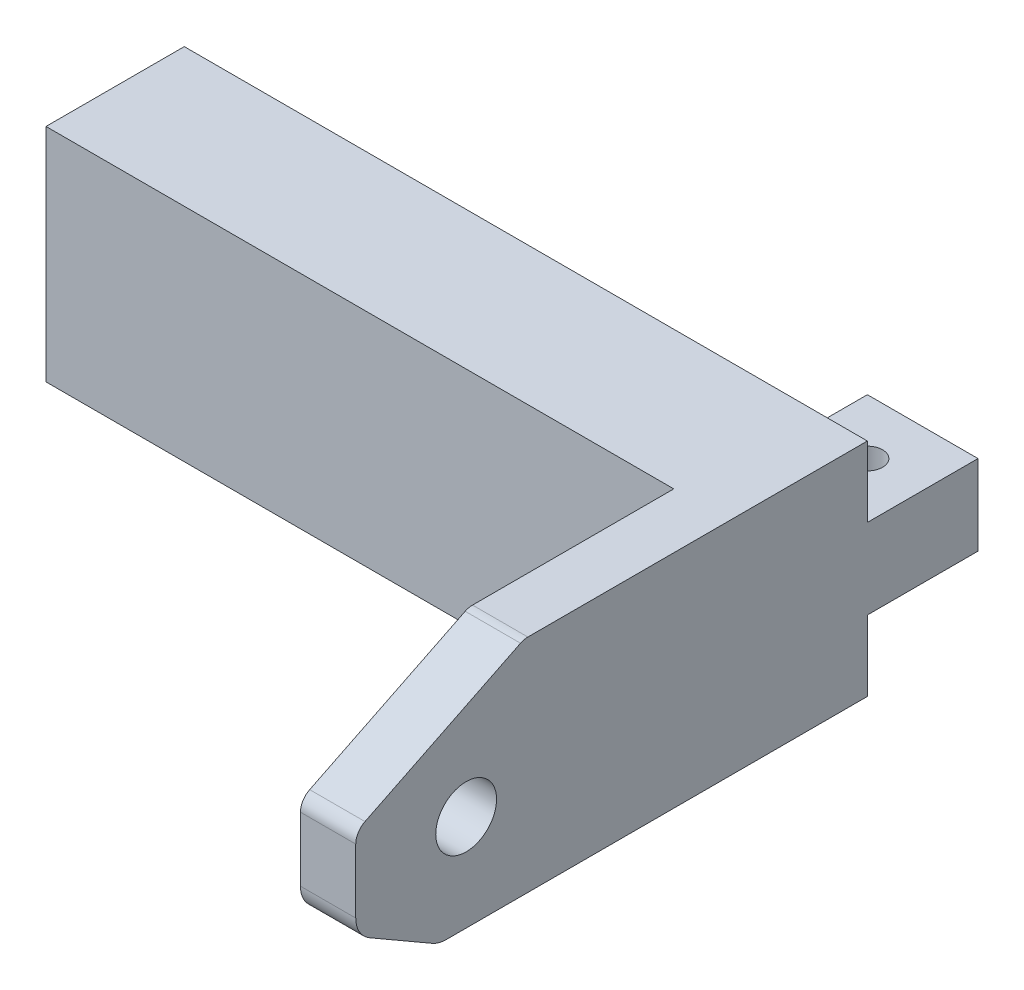
ISO-10303-21;
HEADER;
FILE_DESCRIPTION(('STEP AP214'),'2;1');
FILE_NAME('part.step','',(''),(''),'','','');
FILE_SCHEMA(('AUTOMOTIVE_DESIGN { 1 0 10303 214 1 1 1 1 }'));
ENDSEC;
DATA;
#1=APPLICATION_CONTEXT('core data for automotive mechanical design processes');
#2=APPLICATION_PROTOCOL_DEFINITION('international standard','automotive_design',2000,#1);
#3=PRODUCT_CONTEXT('',#1,'mechanical');
#4=PRODUCT('Part','Part','',(#3));
#5=PRODUCT_RELATED_PRODUCT_CATEGORY('part','',(#4));
#6=PRODUCT_DEFINITION_FORMATION('','',#4);
#7=PRODUCT_DEFINITION_CONTEXT('part definition',#1,'design');
#8=PRODUCT_DEFINITION('design','',#6,#7);
#9=PRODUCT_DEFINITION_SHAPE('','',#8);
#10=(LENGTH_UNIT() NAMED_UNIT(*) SI_UNIT(.MILLI.,.METRE.));
#11=(NAMED_UNIT(*) PLANE_ANGLE_UNIT() SI_UNIT($,.RADIAN.));
#12=(NAMED_UNIT(*) SI_UNIT($,.STERADIAN.) SOLID_ANGLE_UNIT());
#13=UNCERTAINTY_MEASURE_WITH_UNIT(LENGTH_MEASURE(1.E-05),#10,'distance_accuracy_value','');
#14=(GEOMETRIC_REPRESENTATION_CONTEXT(3) GLOBAL_UNCERTAINTY_ASSIGNED_CONTEXT((#13)) GLOBAL_UNIT_ASSIGNED_CONTEXT((#10,
#11,#12)) REPRESENTATION_CONTEXT('',''));
#15=CARTESIAN_POINT('',(0.,0.,0.));
#16=DIRECTION('',(0.,0.,1.));
#17=DIRECTION('',(1.,0.,0.));
#18=AXIS2_PLACEMENT_3D('',#15,#16,#17);
#19=CARTESIAN_POINT('',(10.,20.1295731707317,-35.9146341463414));
#20=DIRECTION('',(0.,0.,1.));
#21=DIRECTION('',(0.,1.,0.));
#22=AXIS2_PLACEMENT_3D('',#19,#20,#21);
#23=PLANE('',#22);
#24=DIRECTION('',(1.,0.,0.));
#25=VECTOR('',#24,1.);
#26=CARTESIAN_POINT('',(-10.,-7.12042682926831,-35.9146341463414));
#27=LINE('',#26,#25);
#28=CARTESIAN_POINT('',(-10.,-7.12042682926831,-35.9146341463414));
#29=VERTEX_POINT('',#28);
#30=CARTESIAN_POINT('',(10.,-7.12042682926831,-35.9146341463414));
#31=VERTEX_POINT('',#30);
#32=EDGE_CURVE('E218',#29,#31,#27,.T.);
#33=ORIENTED_EDGE('',*,*,#32,.T.);
#34=DIRECTION('',(0.,-1.,0.));
#35=VECTOR('',#34,1.);
#36=CARTESIAN_POINT('',(10.,20.1295731707317,-35.9146341463414));
#37=LINE('',#36,#35);
#38=CARTESIAN_POINT('',(10.,-19.8704268292683,-35.9146341463414));
#39=VERTEX_POINT('',#38);
#40=EDGE_CURVE('E285',#31,#39,#37,.T.);
#41=ORIENTED_EDGE('',*,*,#40,.T.);
#42=DIRECTION('',(-1.,0.,0.));
#43=VECTOR('',#42,1.);
#44=CARTESIAN_POINT('',(10.,-19.8704268292683,-35.9146341463414));
#45=LINE('',#44,#43);
#46=CARTESIAN_POINT('',(-113.5,-19.8704268292683,-35.9146341463414));
#47=VERTEX_POINT('',#46);
#48=EDGE_CURVE('E304',#39,#47,#45,.T.);
#49=ORIENTED_EDGE('',*,*,#48,.T.);
#50=DIRECTION('',(0.,1.,0.));
#51=VECTOR('',#50,1.);
#52=CARTESIAN_POINT('',(-113.5,20.1295731707317,-35.9146341463414));
#53=LINE('',#52,#51);
#54=CARTESIAN_POINT('',(-113.5,20.1295731707317,-35.9146341463414));
#55=VERTEX_POINT('',#54);
#56=EDGE_CURVE('E263',#47,#55,#53,.T.);
#57=ORIENTED_EDGE('',*,*,#56,.T.);
#58=DIRECTION('',(-1.,0.,0.));
#59=VECTOR('',#58,1.);
#60=CARTESIAN_POINT('',(10.,20.1295731707317,-35.9146341463414));
#61=LINE('',#60,#59);
#62=CARTESIAN_POINT('',(10.,20.1295731707317,-35.9146341463414));
#63=VERTEX_POINT('',#62);
#64=EDGE_CURVE('E293',#63,#55,#61,.T.);
#65=ORIENTED_EDGE('',*,*,#64,.F.);
#66=CARTESIAN_POINT('',(10.,7.37957317073169,-35.9146341463414));
#67=VERTEX_POINT('',#66);
#68=EDGE_CURVE('E282',#63,#67,#37,.T.);
#69=ORIENTED_EDGE('',*,*,#68,.T.);
#70=DIRECTION('',(-1.,0.,0.));
#71=VECTOR('',#70,1.);
#72=CARTESIAN_POINT('',(-10.,7.37957317073169,-35.9146341463414));
#73=LINE('',#72,#71);
#74=CARTESIAN_POINT('',(-10.,7.37957317073169,-35.9146341463414));
#75=VERTEX_POINT('',#74);
#76=EDGE_CURVE('E210',#67,#75,#73,.T.);
#77=ORIENTED_EDGE('',*,*,#76,.T.);
#78=DIRECTION('',(0.,-1.,0.));
#79=VECTOR('',#78,1.);
#80=CARTESIAN_POINT('',(-10.,7.37957317073169,-35.9146341463414));
#81=LINE('',#80,#79);
#82=EDGE_CURVE('E221',#75,#29,#81,.T.);
#83=ORIENTED_EDGE('',*,*,#82,.T.);
#84=EDGE_LOOP('',(#33,#41,#49,#57,#65,#69,#77,#83));
#85=FACE_BOUND('',#84,.T.);
#86=ADVANCED_FACE('F45',(#85),#23,.F.);
#87=CARTESIAN_POINT('',(0.,0.,0.));
#88=DIRECTION('',(1.,0.,0.));
#89=DIRECTION('',(0.,0.,1.));
#90=AXIS2_PLACEMENT_3D('',#87,#88,#89);
#91=PLANE('',#90);
#92=CARTESIAN_POINT('',(0.,-2.43042682926831,36.6253658536586));
#93=DIRECTION('',(1.,0.,0.));
#94=DIRECTION('',(0.,0.,-1.));
#95=AXIS2_PLACEMENT_3D('',#92,#93,#94);
#96=CIRCLE('',#95,5.5);
#97=CARTESIAN_POINT('',(0.,-2.43042682926831,31.1253658536586));
#98=VERTEX_POINT('',#97);
#99=EDGE_CURVE('E275',#98,#98,#96,.T.);
#100=ORIENTED_EDGE('',*,*,#99,.T.);
#101=EDGE_LOOP('',(#100));
#102=FACE_BOUND('',#101,.T.);
#103=DIRECTION('',(0.,0.499999999999998,0.86602540378444));
#104=VECTOR('',#103,1.);
#105=CARTESIAN_POINT('',(0.,-11.2101727914239,56.5853658536586));
#106=LINE('',#105,#104);
#107=CARTESIAN_POINT('',(0.,-12.653548464398,54.0853658536586));
#108=VERTEX_POINT('',#107);
#109=CARTESIAN_POINT('',(0.,-19.2005538481905,42.7456198915029));
#110=VERTEX_POINT('',#109);
#111=EDGE_CURVE('E363',#108,#110,#106,.F.);
#112=ORIENTED_EDGE('',*,*,#111,.F.);
#113=CARTESIAN_POINT('',(0.,-8.32342144547579,51.5853658536586));
#114=DIRECTION('',(-1.,0.,0.));
#115=DIRECTION('',(0.,0.,1.));
#116=AXIS2_PLACEMENT_3D('',#113,#114,#115);
#117=CIRCLE('',#116,5.);
#118=CARTESIAN_POINT('',(0.,-8.32342144547579,56.5853658536586));
#119=VERTEX_POINT('',#118);
#120=EDGE_CURVE('E381',#119,#108,#117,.F.);
#121=ORIENTED_EDGE('',*,*,#120,.F.);
#122=DIRECTION('',(0.,1.,0.));
#123=VECTOR('',#122,1.);
#124=CARTESIAN_POINT('',(0.,20.1295731707317,56.5853658536586));
#125=LINE('',#124,#123);
#126=CARTESIAN_POINT('',(0.,3.2640532905269,56.5853658536586));
#127=VERTEX_POINT('',#126);
#128=EDGE_CURVE('E296',#119,#127,#125,.T.);
#129=ORIENTED_EDGE('',*,*,#128,.T.);
#130=CARTESIAN_POINT('',(0.,3.2640532905269,53.5853658536586));
#131=DIRECTION('',(-1.,0.,0.));
#132=DIRECTION('',(0.,0.,1.));
#133=AXIS2_PLACEMENT_3D('',#130,#131,#132);
#134=CIRCLE('',#133,3.);
#135=CARTESIAN_POINT('',(0.,5.95467151512495,54.9122319243156));
#136=VERTEX_POINT('',#135);
#137=EDGE_CURVE('E345',#136,#127,#134,.F.);
#138=ORIENTED_EDGE('',*,*,#137,.F.);
#139=DIRECTION('',(0.,0.442288690219003,-0.896872741532688));
#140=VECTOR('',#139,1.);
#141=CARTESIAN_POINT('',(0.,20.1295731707317,26.1683748238203));
#142=LINE('',#141,#140);
#143=CARTESIAN_POINT('',(0.,19.8201913953298,26.7957390029667));
#144=VERTEX_POINT('',#143);
#145=EDGE_CURVE('E331',#144,#136,#142,.F.);
#146=ORIENTED_EDGE('',*,*,#145,.F.);
#147=CARTESIAN_POINT('',(0.,17.1295731707317,25.4688729323097));
#148=DIRECTION('',(-1.,0.,0.));
#149=DIRECTION('',(0.,0.,1.));
#150=AXIS2_PLACEMENT_3D('',#147,#148,#149);
#151=CIRCLE('',#150,3.);
#152=CARTESIAN_POINT('',(0.,20.1295731707317,25.4688729323097));
#153=VERTEX_POINT('',#152);
#154=EDGE_CURVE('E348',#153,#144,#151,.F.);
#155=ORIENTED_EDGE('',*,*,#154,.F.);
#156=DIRECTION('',(0.,0.,-1.));
#157=VECTOR('',#156,1.);
#158=CARTESIAN_POINT('',(0.,20.1295731707317,-35.9146341463414));
#159=LINE('',#158,#157);
#160=CARTESIAN_POINT('',(0.,20.1295731707317,-10.9146341463414));
#161=VERTEX_POINT('',#160);
#162=EDGE_CURVE('E299',#153,#161,#159,.T.);
#163=ORIENTED_EDGE('',*,*,#162,.T.);
#164=DIRECTION('',(0.,-1.,0.));
#165=VECTOR('',#164,1.);
#166=CARTESIAN_POINT('',(0.,20.1295731707317,-10.9146341463414));
#167=LINE('',#166,#165);
#168=CARTESIAN_POINT('',(0.,-19.8704268292683,-10.9146341463414));
#169=VERTEX_POINT('',#168);
#170=EDGE_CURVE('E258',#161,#169,#167,.T.);
#171=ORIENTED_EDGE('',*,*,#170,.T.);
#172=DIRECTION('',(0.,0.,1.));
#173=VECTOR('',#172,1.);
#174=CARTESIAN_POINT('',(0.,-19.8704268292683,-35.9146341463414));
#175=LINE('',#174,#173);
#176=CARTESIAN_POINT('',(0.,-19.8704268292683,40.2456198915029));
#177=VERTEX_POINT('',#176);
#178=EDGE_CURVE('E281',#169,#177,#175,.T.);
#179=ORIENTED_EDGE('',*,*,#178,.T.);
#180=CARTESIAN_POINT('',(0.,-14.8704268292683,40.2456198915029));
#181=DIRECTION('',(-1.,0.,0.));
#182=DIRECTION('',(0.,0.,1.));
#183=AXIS2_PLACEMENT_3D('',#180,#181,#182);
#184=CIRCLE('',#183,5.);
#185=EDGE_CURVE('E54',#110,#177,#184,.F.);
#186=ORIENTED_EDGE('',*,*,#185,.F.);
#187=EDGE_LOOP('',(#112,#121,#129,#138,#146,#155,#163,#171,#179,#186));
#188=FACE_BOUND('',#187,.T.);
#189=ADVANCED_FACE('F391',(#102,#188),#91,.F.);
#190=CARTESIAN_POINT('',(10.,-19.8704268292683,-35.9146341463414));
#191=DIRECTION('',(0.,1.,0.));
#192=DIRECTION('',(0.,0.,-1.));
#193=AXIS2_PLACEMENT_3D('',#190,#191,#192);
#194=PLANE('',#193);
#195=ORIENTED_EDGE('',*,*,#178,.F.);
#196=DIRECTION('',(1.,0.,0.));
#197=VECTOR('',#196,1.);
#198=CARTESIAN_POINT('',(-113.5,-19.8704268292683,-10.9146341463414));
#199=LINE('',#198,#197);
#200=CARTESIAN_POINT('',(-113.5,-19.8704268292683,-10.9146341463414));
#201=VERTEX_POINT('',#200);
#202=EDGE_CURVE('E273',#201,#169,#199,.T.);
#203=ORIENTED_EDGE('',*,*,#202,.F.);
#204=DIRECTION('',(0.,0.,-1.));
#205=VECTOR('',#204,1.);
#206=CARTESIAN_POINT('',(-113.5,-19.8704268292683,-10.9146341463414));
#207=LINE('',#206,#205);
#208=EDGE_CURVE('E261',#201,#47,#207,.T.);
#209=ORIENTED_EDGE('',*,*,#208,.T.);
#210=ORIENTED_EDGE('',*,*,#48,.F.);
#211=DIRECTION('',(0.,0.,1.));
#212=VECTOR('',#211,1.);
#213=CARTESIAN_POINT('',(10.,-19.8704268292683,-35.9146341463414));
#214=LINE('',#213,#212);
#215=CARTESIAN_POINT('',(10.,-19.8704268292683,40.2456198915029));
#216=VERTEX_POINT('',#215);
#217=EDGE_CURVE('E284',#39,#216,#214,.T.);
#218=ORIENTED_EDGE('',*,*,#217,.T.);
#219=DIRECTION('',(-1.,0.,0.));
#220=VECTOR('',#219,1.);
#221=CARTESIAN_POINT('',(10.,-19.8704268292683,40.2456198915029));
#222=LINE('',#221,#220);
#223=EDGE_CURVE('E369',#177,#216,#222,.F.);
#224=ORIENTED_EDGE('',*,*,#223,.F.);
#225=EDGE_LOOP('',(#195,#203,#209,#210,#218,#224));
#226=FACE_BOUND('',#225,.T.);
#227=ADVANCED_FACE('F395',(#226),#194,.F.);
#228=CARTESIAN_POINT('',(10.,20.1295731707317,56.5853658536586));
#229=DIRECTION('',(0.,0.,-1.));
#230=DIRECTION('',(1.,0.,0.));
#231=AXIS2_PLACEMENT_3D('',#228,#229,#230);
#232=PLANE('',#231);
#233=DIRECTION('',(0.,1.,0.));
#234=VECTOR('',#233,1.);
#235=CARTESIAN_POINT('',(10.,20.1295731707317,56.5853658536586));
#236=LINE('',#235,#234);
#237=CARTESIAN_POINT('',(10.,-8.32342144547579,56.5853658536586));
#238=VERTEX_POINT('',#237);
#239=CARTESIAN_POINT('',(10.,3.2640532905269,56.5853658536586));
#240=VERTEX_POINT('',#239);
#241=EDGE_CURVE('E288',#238,#240,#236,.T.);
#242=ORIENTED_EDGE('',*,*,#241,.T.);
#243=DIRECTION('',(-1.,0.,0.));
#244=VECTOR('',#243,1.);
#245=CARTESIAN_POINT('',(10.,3.2640532905269,56.5853658536586));
#246=LINE('',#245,#244);
#247=EDGE_CURVE('E360',#127,#240,#246,.F.);
#248=ORIENTED_EDGE('',*,*,#247,.F.);
#249=ORIENTED_EDGE('',*,*,#128,.F.);
#250=DIRECTION('',(1.,0.,0.));
#251=VECTOR('',#250,1.);
#252=CARTESIAN_POINT('',(0.,-8.32342144547579,56.5853658536586));
#253=LINE('',#252,#251);
#254=EDGE_CURVE('E11',#238,#119,#253,.F.);
#255=ORIENTED_EDGE('',*,*,#254,.F.);
#256=EDGE_LOOP('',(#242,#248,#249,#255));
#257=FACE_BOUND('',#256,.T.);
#258=ADVANCED_FACE('F409',(#257),#232,.F.);
#259=CARTESIAN_POINT('',(10.,20.1295731707317,-35.9146341463414));
#260=DIRECTION('',(0.,-1.,0.));
#261=DIRECTION('',(0.,0.,1.));
#262=AXIS2_PLACEMENT_3D('',#259,#260,#261);
#263=PLANE('',#262);
#264=DIRECTION('',(0.,0.,-1.));
#265=VECTOR('',#264,1.);
#266=CARTESIAN_POINT('',(10.,20.1295731707317,-35.9146341463414));
#267=LINE('',#266,#265);
#268=CARTESIAN_POINT('',(10.,20.1295731707317,25.4688729323097));
#269=VERTEX_POINT('',#268);
#270=EDGE_CURVE('E291',#269,#63,#267,.T.);
#271=ORIENTED_EDGE('',*,*,#270,.T.);
#272=ORIENTED_EDGE('',*,*,#64,.T.);
#273=DIRECTION('',(0.,0.,1.));
#274=VECTOR('',#273,1.);
#275=CARTESIAN_POINT('',(-113.5,20.1295731707317,-10.9146341463414));
#276=LINE('',#275,#274);
#277=CARTESIAN_POINT('',(-113.5,20.1295731707317,-10.9146341463414));
#278=VERTEX_POINT('',#277);
#279=EDGE_CURVE('E266',#55,#278,#276,.T.);
#280=ORIENTED_EDGE('',*,*,#279,.T.);
#281=DIRECTION('',(1.,0.,0.));
#282=VECTOR('',#281,1.);
#283=CARTESIAN_POINT('',(-113.5,20.1295731707317,-10.9146341463414));
#284=LINE('',#283,#282);
#285=EDGE_CURVE('E269',#278,#161,#284,.T.);
#286=ORIENTED_EDGE('',*,*,#285,.T.);
#287=ORIENTED_EDGE('',*,*,#162,.F.);
#288=DIRECTION('',(1.,0.,0.));
#289=VECTOR('',#288,1.);
#290=CARTESIAN_POINT('',(0.,20.1295731707317,25.4688729323097));
#291=LINE('',#290,#289);
#292=EDGE_CURVE('E343',#269,#153,#291,.F.);
#293=ORIENTED_EDGE('',*,*,#292,.F.);
#294=EDGE_LOOP('',(#271,#272,#280,#286,#287,#293));
#295=FACE_BOUND('',#294,.T.);
#296=ADVANCED_FACE('F424',(#295),#263,.F.);
#297=CARTESIAN_POINT('',(10.,0.,0.));
#298=DIRECTION('',(1.,0.,0.));
#299=DIRECTION('',(0.,0.,1.));
#300=AXIS2_PLACEMENT_3D('',#297,#298,#299);
#301=PLANE('',#300);
#302=CARTESIAN_POINT('',(10.,-2.43042682926831,36.6253658536586));
#303=DIRECTION('',(-1.,0.,0.));
#304=DIRECTION('',(0.,0.,1.));
#305=AXIS2_PLACEMENT_3D('',#302,#303,#304);
#306=CIRCLE('',#305,5.5);
#307=CARTESIAN_POINT('',(10.,-2.43042682926831,42.1253658536586));
#308=VERTEX_POINT('',#307);
#309=EDGE_CURVE('E278',#308,#308,#306,.T.);
#310=ORIENTED_EDGE('',*,*,#309,.T.);
#311=EDGE_LOOP('',(#310));
#312=FACE_BOUND('',#311,.T.);
#313=ORIENTED_EDGE('',*,*,#217,.F.);
#314=ORIENTED_EDGE('',*,*,#40,.F.);
#315=DIRECTION('',(0.,0.,1.));
#316=VECTOR('',#315,1.);
#317=CARTESIAN_POINT('',(10.,-7.12042682926831,-55.9146341463414));
#318=LINE('',#317,#316);
#319=CARTESIAN_POINT('',(10.,-7.12042682926831,-55.9146341463414));
#320=VERTEX_POINT('',#319);
#321=EDGE_CURVE('E69',#320,#31,#318,.T.);
#322=ORIENTED_EDGE('',*,*,#321,.F.);
#323=DIRECTION('',(0.,1.,0.));
#324=VECTOR('',#323,1.);
#325=CARTESIAN_POINT('',(10.,7.37957317073169,-55.9146341463414));
#326=LINE('',#325,#324);
#327=CARTESIAN_POINT('',(10.,7.37957317073169,-55.9146341463414));
#328=VERTEX_POINT('',#327);
#329=EDGE_CURVE('E201',#320,#328,#326,.T.);
#330=ORIENTED_EDGE('',*,*,#329,.T.);
#331=DIRECTION('',(0.,0.,1.));
#332=VECTOR('',#331,1.);
#333=CARTESIAN_POINT('',(10.,7.37957317073169,-55.9146341463414));
#334=LINE('',#333,#332);
#335=EDGE_CURVE('E207',#328,#67,#334,.T.);
#336=ORIENTED_EDGE('',*,*,#335,.T.);
#337=ORIENTED_EDGE('',*,*,#68,.F.);
#338=ORIENTED_EDGE('',*,*,#270,.F.);
#339=CARTESIAN_POINT('',(10.,17.1295731707317,25.4688729323097));
#340=DIRECTION('',(-1.,0.,0.));
#341=DIRECTION('',(0.,0.,1.));
#342=AXIS2_PLACEMENT_3D('',#339,#340,#341);
#343=CIRCLE('',#342,3.);
#344=CARTESIAN_POINT('',(10.,19.8201913953298,26.7957390029667));
#345=VERTEX_POINT('',#344);
#346=EDGE_CURVE('E358',#345,#269,#343,.T.);
#347=ORIENTED_EDGE('',*,*,#346,.F.);
#348=DIRECTION('',(0.,-0.442288690219003,0.896872741532688));
#349=VECTOR('',#348,1.);
#350=CARTESIAN_POINT('',(10.,26.5722242379764,13.1039708424363));
#351=LINE('',#350,#349);
#352=CARTESIAN_POINT('',(10.,5.95467151512495,54.9122319243156));
#353=VERTEX_POINT('',#352);
#354=EDGE_CURVE('E340',#353,#345,#351,.F.);
#355=ORIENTED_EDGE('',*,*,#354,.F.);
#356=CARTESIAN_POINT('',(10.,3.2640532905269,53.5853658536586));
#357=DIRECTION('',(-1.,0.,0.));
#358=DIRECTION('',(0.,0.,1.));
#359=AXIS2_PLACEMENT_3D('',#356,#357,#358);
#360=CIRCLE('',#359,3.);
#361=EDGE_CURVE('E355',#240,#353,#360,.T.);
#362=ORIENTED_EDGE('',*,*,#361,.F.);
#363=ORIENTED_EDGE('',*,*,#241,.F.);
#364=CARTESIAN_POINT('',(10.,-8.32342144547579,51.5853658536586));
#365=DIRECTION('',(-1.,0.,0.));
#366=DIRECTION('',(0.,0.,1.));
#367=AXIS2_PLACEMENT_3D('',#364,#365,#366);
#368=CIRCLE('',#367,5.);
#369=CARTESIAN_POINT('',(10.,-12.653548464398,54.0853658536586));
#370=VERTEX_POINT('',#369);
#371=EDGE_CURVE('E372',#370,#238,#368,.T.);
#372=ORIENTED_EDGE('',*,*,#371,.F.);
#373=DIRECTION('',(0.,-0.499999999999998,-0.86602540378444));
#374=VECTOR('',#373,1.);
#375=CARTESIAN_POINT('',(10.,-32.9098117494203,19.0004886725076));
#376=LINE('',#375,#374);
#377=CARTESIAN_POINT('',(10.,-19.2005538481905,42.7456198915029));
#378=VERTEX_POINT('',#377);
#379=EDGE_CURVE('E366',#378,#370,#376,.F.);
#380=ORIENTED_EDGE('',*,*,#379,.F.);
#381=CARTESIAN_POINT('',(10.,-14.8704268292683,40.2456198915029));
#382=DIRECTION('',(-1.,0.,0.));
#383=DIRECTION('',(0.,0.,1.));
#384=AXIS2_PLACEMENT_3D('',#381,#382,#383);
#385=CIRCLE('',#384,5.);
#386=EDGE_CURVE('E374',#216,#378,#385,.T.);
#387=ORIENTED_EDGE('',*,*,#386,.F.);
#388=EDGE_LOOP('',(#313,#314,#322,#330,#336,#337,#338,#347,#355,#362,#363,#372,#380,#387));
#389=FACE_BOUND('',#388,.T.);
#390=ADVANCED_FACE('F217',(#312,#389),#301,.T.);
#391=CARTESIAN_POINT('',(27.,-2.43042682926831,36.6253658536586));
#392=DIRECTION('',(-1.,0.,0.));
#393=DIRECTION('',(0.,0.,-1.));
#394=AXIS2_PLACEMENT_3D('',#391,#392,#393);
#395=CYLINDRICAL_SURFACE('',#394,5.5);
#396=ORIENTED_EDGE('',*,*,#309,.F.);
#397=EDGE_LOOP('',(#396));
#398=FACE_BOUND('',#397,.T.);
#399=ORIENTED_EDGE('',*,*,#99,.F.);
#400=EDGE_LOOP('',(#399));
#401=FACE_BOUND('',#400,.T.);
#402=ADVANCED_FACE('F535',(#398,#401),#395,.F.);
#403=CARTESIAN_POINT('',(-113.5,0.,0.));
#404=DIRECTION('',(-1.,0.,0.));
#405=DIRECTION('',(0.,0.,-1.));
#406=AXIS2_PLACEMENT_3D('',#403,#404,#405);
#407=PLANE('',#406);
#408=DIRECTION('',(0.,1.,0.));
#409=VECTOR('',#408,1.);
#410=CARTESIAN_POINT('',(-113.5,0.,-31.5396341463414));
#411=LINE('',#410,#409);
#412=CARTESIAN_POINT('',(-113.5,15.7545731707317,-31.5396341463414));
#413=VERTEX_POINT('',#412);
#414=CARTESIAN_POINT('',(-113.5,-15.4954268292683,-31.5396341463414));
#415=VERTEX_POINT('',#414);
#416=EDGE_CURVE('E316',#413,#415,#411,.F.);
#417=ORIENTED_EDGE('',*,*,#416,.F.);
#418=DIRECTION('',(0.,0.,1.));
#419=VECTOR('',#418,1.);
#420=CARTESIAN_POINT('',(-113.5,15.7545731707317,0.));
#421=LINE('',#420,#419);
#422=CARTESIAN_POINT('',(-113.5,15.7545731707317,-15.2896341463414));
#423=VERTEX_POINT('',#422);
#424=EDGE_CURVE('E313',#423,#413,#421,.F.);
#425=ORIENTED_EDGE('',*,*,#424,.F.);
#426=DIRECTION('',(0.,-1.,0.));
#427=VECTOR('',#426,1.);
#428=CARTESIAN_POINT('',(-113.5,0.,-15.2896341463414));
#429=LINE('',#428,#427);
#430=CARTESIAN_POINT('',(-113.5,-15.4954268292683,-15.2896341463414));
#431=VERTEX_POINT('',#430);
#432=EDGE_CURVE('E310',#431,#423,#429,.F.);
#433=ORIENTED_EDGE('',*,*,#432,.F.);
#434=DIRECTION('',(0.,0.,-1.));
#435=VECTOR('',#434,1.);
#436=CARTESIAN_POINT('',(-113.5,-15.4954268292683,0.));
#437=LINE('',#436,#435);
#438=EDGE_CURVE('E319',#415,#431,#437,.F.);
#439=ORIENTED_EDGE('',*,*,#438,.F.);
#440=EDGE_LOOP('',(#417,#425,#433,#439));
#441=FACE_BOUND('',#440,.T.);
#442=DIRECTION('',(0.,-1.,0.));
#443=VECTOR('',#442,1.);
#444=CARTESIAN_POINT('',(-113.5,20.1295731707317,-10.9146341463414));
#445=LINE('',#444,#443);
#446=EDGE_CURVE('E259',#278,#201,#445,.T.);
#447=ORIENTED_EDGE('',*,*,#446,.F.);
#448=ORIENTED_EDGE('',*,*,#279,.F.);
#449=ORIENTED_EDGE('',*,*,#56,.F.);
#450=ORIENTED_EDGE('',*,*,#208,.F.);
#451=EDGE_LOOP('',(#447,#448,#449,#450));
#452=FACE_BOUND('',#451,.T.);
#453=ADVANCED_FACE('F431',(#441,#452),#407,.T.);
#454=CARTESIAN_POINT('',(-113.5,20.1295731707317,-10.9146341463414));
#455=DIRECTION('',(0.,0.,-1.));
#456=DIRECTION('',(0.,-1.,0.));
#457=AXIS2_PLACEMENT_3D('',#454,#455,#456);
#458=PLANE('',#457);
#459=ORIENTED_EDGE('',*,*,#170,.F.);
#460=ORIENTED_EDGE('',*,*,#285,.F.);
#461=ORIENTED_EDGE('',*,*,#446,.T.);
#462=ORIENTED_EDGE('',*,*,#202,.T.);
#463=EDGE_LOOP('',(#459,#460,#461,#462));
#464=FACE_BOUND('',#463,.T.);
#465=ADVANCED_FACE('F427',(#464),#458,.F.);
#466=CARTESIAN_POINT('',(-113.5,12.7545731707317,-18.2896341463414));
#467=DIRECTION('',(0.,-1.,0.));
#468=DIRECTION('',(0.,0.,1.));
#469=AXIS2_PLACEMENT_3D('',#466,#467,#468);
#470=PLANE('',#469);
#471=DIRECTION('',(1.,0.,0.));
#472=VECTOR('',#471,1.);
#473=CARTESIAN_POINT('',(-113.5,12.7545731707317,-28.5396341463414));
#474=LINE('',#473,#472);
#475=CARTESIAN_POINT('',(-110.5,12.7545731707317,-28.5396341463414));
#476=VERTEX_POINT('',#475);
#477=CARTESIAN_POINT('',(0.,12.7545731707317,-28.5396341463414));
#478=VERTEX_POINT('',#477);
#479=EDGE_CURVE('E246',#476,#478,#474,.T.);
#480=ORIENTED_EDGE('',*,*,#479,.T.);
#481=DIRECTION('',(0.,0.,1.));
#482=VECTOR('',#481,1.);
#483=CARTESIAN_POINT('',(0.,12.7545731707317,-18.2896341463414));
#484=LINE('',#483,#482);
#485=CARTESIAN_POINT('',(0.,12.7545731707317,-18.2896341463414));
#486=VERTEX_POINT('',#485);
#487=EDGE_CURVE('E234',#478,#486,#484,.T.);
#488=ORIENTED_EDGE('',*,*,#487,.T.);
#489=DIRECTION('',(1.,0.,0.));
#490=VECTOR('',#489,1.);
#491=CARTESIAN_POINT('',(-113.5,12.7545731707317,-18.2896341463414));
#492=LINE('',#491,#490);
#493=CARTESIAN_POINT('',(-110.5,12.7545731707317,-18.2896341463414));
#494=VERTEX_POINT('',#493);
#495=EDGE_CURVE('E255',#494,#486,#492,.T.);
#496=ORIENTED_EDGE('',*,*,#495,.F.);
#497=DIRECTION('',(0.,0.,1.));
#498=VECTOR('',#497,1.);
#499=CARTESIAN_POINT('',(-110.5,12.7545731707317,-18.2896341463414));
#500=LINE('',#499,#498);
#501=EDGE_CURVE('E325',#476,#494,#500,.T.);
#502=ORIENTED_EDGE('',*,*,#501,.F.);
#503=EDGE_LOOP('',(#480,#488,#496,#502));
#504=FACE_BOUND('',#503,.T.);
#505=ADVANCED_FACE('F574',(#504),#470,.T.);
#506=CARTESIAN_POINT('',(-113.5,12.7545731707317,-18.2896341463414));
#507=DIRECTION('',(0.,0.,-1.));
#508=DIRECTION('',(0.,-1.,0.));
#509=AXIS2_PLACEMENT_3D('',#506,#507,#508);
#510=PLANE('',#509);
#511=ORIENTED_EDGE('',*,*,#495,.T.);
#512=DIRECTION('',(0.,-1.,0.));
#513=VECTOR('',#512,1.);
#514=CARTESIAN_POINT('',(0.,12.7545731707317,-18.2896341463414));
#515=LINE('',#514,#513);
#516=CARTESIAN_POINT('',(0.,-12.4954268292683,-18.2896341463414));
#517=VERTEX_POINT('',#516);
#518=EDGE_CURVE('E237',#486,#517,#515,.T.);
#519=ORIENTED_EDGE('',*,*,#518,.T.);
#520=DIRECTION('',(1.,0.,0.));
#521=VECTOR('',#520,1.);
#522=CARTESIAN_POINT('',(-113.5,-12.4954268292683,-18.2896341463414));
#523=LINE('',#522,#521);
#524=CARTESIAN_POINT('',(-110.5,-12.4954268292683,-18.2896341463414));
#525=VERTEX_POINT('',#524);
#526=EDGE_CURVE('E252',#525,#517,#523,.T.);
#527=ORIENTED_EDGE('',*,*,#526,.F.);
#528=DIRECTION('',(0.,-1.,0.));
#529=VECTOR('',#528,1.);
#530=CARTESIAN_POINT('',(-110.5,12.7545731707317,-18.2896341463414));
#531=LINE('',#530,#529);
#532=EDGE_CURVE('E328',#494,#525,#531,.T.);
#533=ORIENTED_EDGE('',*,*,#532,.F.);
#534=EDGE_LOOP('',(#511,#519,#527,#533));
#535=FACE_BOUND('',#534,.T.);
#536=ADVANCED_FACE('F582',(#535),#510,.T.);
#537=CARTESIAN_POINT('',(-113.5,-12.4954268292683,-18.2896341463414));
#538=DIRECTION('',(0.,1.,0.));
#539=DIRECTION('',(0.,0.,-1.));
#540=AXIS2_PLACEMENT_3D('',#537,#538,#539);
#541=PLANE('',#540);
#542=ORIENTED_EDGE('',*,*,#526,.T.);
#543=DIRECTION('',(0.,0.,-1.));
#544=VECTOR('',#543,1.);
#545=CARTESIAN_POINT('',(0.,-12.4954268292683,-18.2896341463414));
#546=LINE('',#545,#544);
#547=CARTESIAN_POINT('',(0.,-12.4954268292683,-28.5396341463414));
#548=VERTEX_POINT('',#547);
#549=EDGE_CURVE('E241',#517,#548,#546,.T.);
#550=ORIENTED_EDGE('',*,*,#549,.T.);
#551=DIRECTION('',(1.,0.,0.));
#552=VECTOR('',#551,1.);
#553=CARTESIAN_POINT('',(-113.5,-12.4954268292683,-28.5396341463414));
#554=LINE('',#553,#552);
#555=CARTESIAN_POINT('',(-110.5,-12.4954268292683,-28.5396341463414));
#556=VERTEX_POINT('',#555);
#557=EDGE_CURVE('E249',#556,#548,#554,.T.);
#558=ORIENTED_EDGE('',*,*,#557,.F.);
#559=DIRECTION('',(0.,0.,-1.));
#560=VECTOR('',#559,1.);
#561=CARTESIAN_POINT('',(-110.5,-12.4954268292683,-18.2896341463414));
#562=LINE('',#561,#560);
#563=EDGE_CURVE('E307',#525,#556,#562,.T.);
#564=ORIENTED_EDGE('',*,*,#563,.F.);
#565=EDGE_LOOP('',(#542,#550,#558,#564));
#566=FACE_BOUND('',#565,.T.);
#567=ADVANCED_FACE('F591',(#566),#541,.T.);
#568=CARTESIAN_POINT('',(-113.5,12.7545731707317,-28.5396341463414));
#569=DIRECTION('',(0.,0.,1.));
#570=DIRECTION('',(0.,1.,0.));
#571=AXIS2_PLACEMENT_3D('',#568,#569,#570);
#572=PLANE('',#571);
#573=ORIENTED_EDGE('',*,*,#557,.T.);
#574=DIRECTION('',(0.,1.,0.));
#575=VECTOR('',#574,1.);
#576=CARTESIAN_POINT('',(0.,12.7545731707317,-28.5396341463414));
#577=LINE('',#576,#575);
#578=EDGE_CURVE('E244',#548,#478,#577,.T.);
#579=ORIENTED_EDGE('',*,*,#578,.T.);
#580=ORIENTED_EDGE('',*,*,#479,.F.);
#581=DIRECTION('',(0.,1.,0.));
#582=VECTOR('',#581,1.);
#583=CARTESIAN_POINT('',(-110.5,12.7545731707317,-28.5396341463414));
#584=LINE('',#583,#582);
#585=EDGE_CURVE('E322',#556,#476,#584,.T.);
#586=ORIENTED_EDGE('',*,*,#585,.F.);
#587=EDGE_LOOP('',(#573,#579,#580,#586));
#588=FACE_BOUND('',#587,.T.);
#589=ADVANCED_FACE('F529',(#588),#572,.T.);
#590=ORIENTED_EDGE('',*,*,#578,.F.);
#591=ORIENTED_EDGE('',*,*,#549,.F.);
#592=ORIENTED_EDGE('',*,*,#518,.F.);
#593=ORIENTED_EDGE('',*,*,#487,.F.);
#594=EDGE_LOOP('',(#590,#591,#592,#593));
#595=FACE_BOUND('',#594,.T.);
#596=ADVANCED_FACE('F453',(#595),#91,.F.);
#597=CARTESIAN_POINT('',(-110.5,15.7545731707317,-18.2896341463414));
#598=DIRECTION('',(0.,0.,1.));
#599=DIRECTION('',(-1.,0.,0.));
#600=AXIS2_PLACEMENT_3D('',#597,#598,#599);
#601=CYLINDRICAL_SURFACE('',#600,3.);
#602=CARTESIAN_POINT('',(-110.5,15.7545731707317,-31.5396341463414));
#603=DIRECTION('',(0.,-0.707106781186547,-0.707106781186548));
#604=DIRECTION('',(0.,0.707106781186548,-0.707106781186547));
#605=AXIS2_PLACEMENT_3D('',#602,#603,#604);
#606=ELLIPSE('',#605,4.24264068711928,3.);
#607=EDGE_CURVE('E335',#413,#476,#606,.F.);
#608=ORIENTED_EDGE('',*,*,#607,.T.);
#609=ORIENTED_EDGE('',*,*,#501,.T.);
#610=CARTESIAN_POINT('',(-110.5,15.7545731707317,-15.2896341463414));
#611=DIRECTION('',(0.,0.707106781186548,-0.707106781186547));
#612=DIRECTION('',(0.,0.707106781186547,0.707106781186548));
#613=AXIS2_PLACEMENT_3D('',#610,#611,#612);
#614=ELLIPSE('',#613,4.24264068711929,3.);
#615=EDGE_CURVE('E238',#494,#423,#614,.T.);
#616=ORIENTED_EDGE('',*,*,#615,.T.);
#617=ORIENTED_EDGE('',*,*,#424,.T.);
#618=EDGE_LOOP('',(#608,#609,#616,#617));
#619=FACE_BOUND('',#618,.T.);
#620=ADVANCED_FACE('F468',(#619),#601,.T.);
#621=CARTESIAN_POINT('',(-110.5,12.7545731707317,-15.2896341463414));
#622=DIRECTION('',(0.,-1.,0.));
#623=DIRECTION('',(0.,0.,1.));
#624=AXIS2_PLACEMENT_3D('',#621,#622,#623);
#625=CYLINDRICAL_SURFACE('',#624,3.);
#626=ORIENTED_EDGE('',*,*,#615,.F.);
#627=ORIENTED_EDGE('',*,*,#532,.T.);
#628=CARTESIAN_POINT('',(-110.5,-15.4954268292683,-15.2896341463414));
#629=DIRECTION('',(0.,0.707106781186547,0.707106781186548));
#630=DIRECTION('',(0.,0.707106781186548,-0.707106781186547));
#631=AXIS2_PLACEMENT_3D('',#628,#629,#630);
#632=ELLIPSE('',#631,4.24264068711928,3.);
#633=EDGE_CURVE('E333',#525,#431,#632,.T.);
#634=ORIENTED_EDGE('',*,*,#633,.T.);
#635=ORIENTED_EDGE('',*,*,#432,.T.);
#636=EDGE_LOOP('',(#626,#627,#634,#635));
#637=FACE_BOUND('',#636,.T.);
#638=ADVANCED_FACE('F464',(#637),#625,.T.);
#639=CARTESIAN_POINT('',(-110.5,12.7545731707317,-31.5396341463414));
#640=DIRECTION('',(0.,1.,0.));
#641=DIRECTION('',(0.,0.,-1.));
#642=AXIS2_PLACEMENT_3D('',#639,#640,#641);
#643=CYLINDRICAL_SURFACE('',#642,3.);
#644=ORIENTED_EDGE('',*,*,#607,.F.);
#645=ORIENTED_EDGE('',*,*,#416,.T.);
#646=CARTESIAN_POINT('',(-110.5,-15.4954268292683,-31.5396341463414));
#647=DIRECTION('',(0.,-0.707106781186548,0.707106781186547));
#648=DIRECTION('',(0.,-0.707106781186547,-0.707106781186548));
#649=AXIS2_PLACEMENT_3D('',#646,#647,#648);
#650=ELLIPSE('',#649,4.24264068711929,3.);
#651=EDGE_CURVE('E214',#415,#556,#650,.F.);
#652=ORIENTED_EDGE('',*,*,#651,.T.);
#653=ORIENTED_EDGE('',*,*,#585,.T.);
#654=EDGE_LOOP('',(#644,#645,#652,#653));
#655=FACE_BOUND('',#654,.T.);
#656=ADVANCED_FACE('F460',(#655),#643,.T.);
#657=CARTESIAN_POINT('',(-110.5,-15.4954268292683,-18.2896341463414));
#658=DIRECTION('',(0.,0.,-1.));
#659=DIRECTION('',(1.,0.,0.));
#660=AXIS2_PLACEMENT_3D('',#657,#658,#659);
#661=CYLINDRICAL_SURFACE('',#660,3.);
#662=ORIENTED_EDGE('',*,*,#633,.F.);
#663=ORIENTED_EDGE('',*,*,#563,.T.);
#664=ORIENTED_EDGE('',*,*,#651,.F.);
#665=ORIENTED_EDGE('',*,*,#438,.T.);
#666=EDGE_LOOP('',(#662,#663,#664,#665));
#667=FACE_BOUND('',#666,.T.);
#668=ADVANCED_FACE('F457',(#667),#661,.T.);
#669=CARTESIAN_POINT('',(10.,20.1295731707317,26.1683748238203));
#670=DIRECTION('',(0.,-0.896872741532688,-0.442288690219002));
#671=DIRECTION('',(-1.,0.,0.));
#672=AXIS2_PLACEMENT_3D('',#669,#670,#671);
#673=PLANE('',#672);
#674=ORIENTED_EDGE('',*,*,#145,.T.);
#675=DIRECTION('',(1.,0.,0.));
#676=VECTOR('',#675,1.);
#677=CARTESIAN_POINT('',(0.,5.95467151512496,54.9122319243156));
#678=LINE('',#677,#676);
#679=EDGE_CURVE('E351',#353,#136,#678,.F.);
#680=ORIENTED_EDGE('',*,*,#679,.F.);
#681=ORIENTED_EDGE('',*,*,#354,.T.);
#682=DIRECTION('',(-1.,0.,0.));
#683=VECTOR('',#682,1.);
#684=CARTESIAN_POINT('',(10.,19.8201913953298,26.7957390029667));
#685=LINE('',#684,#683);
#686=EDGE_CURVE('E353',#144,#345,#685,.F.);
#687=ORIENTED_EDGE('',*,*,#686,.F.);
#688=EDGE_LOOP('',(#674,#680,#681,#687));
#689=FACE_BOUND('',#688,.T.);
#690=ADVANCED_FACE('F415',(#689),#673,.F.);
#691=CARTESIAN_POINT('',(10.,17.1295731707317,25.4688729323097));
#692=DIRECTION('',(-1.,0.,0.));
#693=DIRECTION('',(0.,0.,-1.));
#694=AXIS2_PLACEMENT_3D('',#691,#692,#693);
#695=CYLINDRICAL_SURFACE('',#694,3.);
#696=ORIENTED_EDGE('',*,*,#346,.T.);
#697=ORIENTED_EDGE('',*,*,#292,.T.);
#698=ORIENTED_EDGE('',*,*,#154,.T.);
#699=ORIENTED_EDGE('',*,*,#686,.T.);
#700=EDGE_LOOP('',(#696,#697,#698,#699));
#701=FACE_BOUND('',#700,.T.);
#702=ADVANCED_FACE('F419',(#701),#695,.T.);
#703=CARTESIAN_POINT('',(10.,3.2640532905269,53.5853658536586));
#704=DIRECTION('',(1.,0.,0.));
#705=DIRECTION('',(0.,0.,1.));
#706=AXIS2_PLACEMENT_3D('',#703,#704,#705);
#707=CYLINDRICAL_SURFACE('',#706,3.);
#708=ORIENTED_EDGE('',*,*,#137,.T.);
#709=ORIENTED_EDGE('',*,*,#247,.T.);
#710=ORIENTED_EDGE('',*,*,#361,.T.);
#711=ORIENTED_EDGE('',*,*,#679,.T.);
#712=EDGE_LOOP('',(#708,#709,#710,#711));
#713=FACE_BOUND('',#712,.T.);
#714=ADVANCED_FACE('F411',(#713),#707,.T.);
#715=CARTESIAN_POINT('',(10.,-11.2101727914239,56.5853658536586));
#716=DIRECTION('',(0.,0.86602540378444,-0.499999999999998));
#717=DIRECTION('',(-1.,0.,0.));
#718=AXIS2_PLACEMENT_3D('',#715,#716,#717);
#719=PLANE('',#718);
#720=ORIENTED_EDGE('',*,*,#379,.T.);
#721=DIRECTION('',(-1.,0.,0.));
#722=VECTOR('',#721,1.);
#723=CARTESIAN_POINT('',(10.,-12.653548464398,54.0853658536586));
#724=LINE('',#723,#722);
#725=EDGE_CURVE('E377',#108,#370,#724,.F.);
#726=ORIENTED_EDGE('',*,*,#725,.F.);
#727=ORIENTED_EDGE('',*,*,#111,.T.);
#728=DIRECTION('',(1.,0.,0.));
#729=VECTOR('',#728,1.);
#730=CARTESIAN_POINT('',(0.,-19.2005538481905,42.7456198915029));
#731=LINE('',#730,#729);
#732=EDGE_CURVE('E379',#378,#110,#731,.F.);
#733=ORIENTED_EDGE('',*,*,#732,.F.);
#734=EDGE_LOOP('',(#720,#726,#727,#733));
#735=FACE_BOUND('',#734,.T.);
#736=ADVANCED_FACE('F402',(#735),#719,.F.);
#737=CARTESIAN_POINT('',(10.,-14.8704268292683,40.2456198915029));
#738=DIRECTION('',(1.,0.,0.));
#739=DIRECTION('',(0.,0.,1.));
#740=AXIS2_PLACEMENT_3D('',#737,#738,#739);
#741=CYLINDRICAL_SURFACE('',#740,5.);
#742=ORIENTED_EDGE('',*,*,#185,.T.);
#743=ORIENTED_EDGE('',*,*,#223,.T.);
#744=ORIENTED_EDGE('',*,*,#386,.T.);
#745=ORIENTED_EDGE('',*,*,#732,.T.);
#746=EDGE_LOOP('',(#742,#743,#744,#745));
#747=FACE_BOUND('',#746,.T.);
#748=ADVANCED_FACE('F387',(#747),#741,.T.);
#749=CARTESIAN_POINT('',(10.,-8.32342144547579,51.5853658536586));
#750=DIRECTION('',(-1.,0.,0.));
#751=DIRECTION('',(0.,0.,-1.));
#752=AXIS2_PLACEMENT_3D('',#749,#750,#751);
#753=CYLINDRICAL_SURFACE('',#752,5.);
#754=ORIENTED_EDGE('',*,*,#371,.T.);
#755=ORIENTED_EDGE('',*,*,#254,.T.);
#756=ORIENTED_EDGE('',*,*,#120,.T.);
#757=ORIENTED_EDGE('',*,*,#725,.T.);
#758=EDGE_LOOP('',(#754,#755,#756,#757));
#759=FACE_BOUND('',#758,.T.);
#760=ADVANCED_FACE('F47',(#759),#753,.T.);
#761=CARTESIAN_POINT('',(-10.,7.37957317073169,-55.9146341463414));
#762=DIRECTION('',(0.,-1.,0.));
#763=DIRECTION('',(1.,0.,0.));
#764=AXIS2_PLACEMENT_3D('',#761,#762,#763);
#765=PLANE('',#764);
#766=CARTESIAN_POINT('',(0.,7.37957317073169,-45.9146341463414));
#767=DIRECTION('',(0.,-1.,0.));
#768=DIRECTION('',(0.,0.,-1.));
#769=AXIS2_PLACEMENT_3D('',#766,#767,#768);
#770=CIRCLE('',#769,2.75);
#771=CARTESIAN_POINT('',(0.,7.37957317073169,-48.6646341463414));
#772=VERTEX_POINT('',#771);
#773=EDGE_CURVE('E224',#772,#772,#770,.T.);
#774=ORIENTED_EDGE('',*,*,#773,.T.);
#775=EDGE_LOOP('',(#774));
#776=FACE_BOUND('',#775,.T.);
#777=ORIENTED_EDGE('',*,*,#76,.F.);
#778=ORIENTED_EDGE('',*,*,#335,.F.);
#779=DIRECTION('',(-1.,0.,0.));
#780=VECTOR('',#779,1.);
#781=CARTESIAN_POINT('',(-10.,7.37957317073169,-55.9146341463414));
#782=LINE('',#781,#780);
#783=CARTESIAN_POINT('',(-10.,7.37957317073169,-55.9146341463414));
#784=VERTEX_POINT('',#783);
#785=EDGE_CURVE('E197',#328,#784,#782,.T.);
#786=ORIENTED_EDGE('',*,*,#785,.T.);
#787=DIRECTION('',(0.,0.,1.));
#788=VECTOR('',#787,1.);
#789=CARTESIAN_POINT('',(-10.,7.37957317073169,-55.9146341463414));
#790=LINE('',#789,#788);
#791=EDGE_CURVE('E215',#784,#75,#790,.T.);
#792=ORIENTED_EDGE('',*,*,#791,.T.);
#793=EDGE_LOOP('',(#777,#778,#786,#792));
#794=FACE_BOUND('',#793,.T.);
#795=ADVANCED_FACE('F208',(#776,#794),#765,.F.);
#796=CARTESIAN_POINT('',(-10.,7.37957317073169,-55.9146341463414));
#797=DIRECTION('',(1.,0.,0.));
#798=DIRECTION('',(0.,1.,0.));
#799=AXIS2_PLACEMENT_3D('',#796,#797,#798);
#800=PLANE('',#799);
#801=ORIENTED_EDGE('',*,*,#82,.F.);
#802=ORIENTED_EDGE('',*,*,#791,.F.);
#803=DIRECTION('',(0.,-1.,0.));
#804=VECTOR('',#803,1.);
#805=CARTESIAN_POINT('',(-10.,7.37957317073169,-55.9146341463414));
#806=LINE('',#805,#804);
#807=CARTESIAN_POINT('',(-10.,-7.12042682926831,-55.9146341463414));
#808=VERTEX_POINT('',#807);
#809=EDGE_CURVE('E202',#784,#808,#806,.T.);
#810=ORIENTED_EDGE('',*,*,#809,.T.);
#811=DIRECTION('',(0.,0.,1.));
#812=VECTOR('',#811,1.);
#813=CARTESIAN_POINT('',(-10.,-7.12042682926831,-55.9146341463414));
#814=LINE('',#813,#812);
#815=EDGE_CURVE('E61',#808,#29,#814,.T.);
#816=ORIENTED_EDGE('',*,*,#815,.T.);
#817=EDGE_LOOP('',(#801,#802,#810,#816));
#818=FACE_BOUND('',#817,.T.);
#819=ADVANCED_FACE('F435',(#818),#800,.F.);
#820=CARTESIAN_POINT('',(-10.,-7.12042682926831,-55.9146341463414));
#821=DIRECTION('',(0.,1.,0.));
#822=DIRECTION('',(-1.,0.,0.));
#823=AXIS2_PLACEMENT_3D('',#820,#821,#822);
#824=PLANE('',#823);
#825=CARTESIAN_POINT('',(0.,-7.12042682926831,-45.9146341463414));
#826=DIRECTION('',(0.,-1.,0.));
#827=DIRECTION('',(-1.,0.,0.));
#828=AXIS2_PLACEMENT_3D('',#825,#826,#827);
#829=CIRCLE('',#828,2.75);
#830=CARTESIAN_POINT('',(-2.74999999999999,-7.12042682926831,-45.9146341463414));
#831=VERTEX_POINT('',#830);
#832=EDGE_CURVE('E49',#831,#831,#829,.T.);
#833=ORIENTED_EDGE('',*,*,#832,.F.);
#834=EDGE_LOOP('',(#833));
#835=FACE_BOUND('',#834,.T.);
#836=ORIENTED_EDGE('',*,*,#32,.F.);
#837=ORIENTED_EDGE('',*,*,#815,.F.);
#838=DIRECTION('',(1.,0.,0.));
#839=VECTOR('',#838,1.);
#840=CARTESIAN_POINT('',(-10.,-7.12042682926831,-55.9146341463414));
#841=LINE('',#840,#839);
#842=EDGE_CURVE('E227',#808,#320,#841,.T.);
#843=ORIENTED_EDGE('',*,*,#842,.T.);
#844=ORIENTED_EDGE('',*,*,#321,.T.);
#845=EDGE_LOOP('',(#836,#837,#843,#844));
#846=FACE_BOUND('',#845,.T.);
#847=ADVANCED_FACE('F434',(#835,#846),#824,.F.);
#848=CARTESIAN_POINT('',(0.,0.,-55.9146341463414));
#849=DIRECTION('',(0.,0.,-1.));
#850=DIRECTION('',(1.,0.,0.));
#851=AXIS2_PLACEMENT_3D('',#848,#849,#850);
#852=PLANE('',#851);
#853=ORIENTED_EDGE('',*,*,#329,.F.);
#854=ORIENTED_EDGE('',*,*,#842,.F.);
#855=ORIENTED_EDGE('',*,*,#809,.F.);
#856=ORIENTED_EDGE('',*,*,#785,.F.);
#857=EDGE_LOOP('',(#853,#854,#855,#856));
#858=FACE_BOUND('',#857,.T.);
#859=ADVANCED_FACE('F199',(#858),#852,.T.);
#860=CARTESIAN_POINT('',(0.,7.37957317073169,-45.9146341463414));
#861=DIRECTION('',(0.,1.,0.));
#862=DIRECTION('',(0.,0.,-1.));
#863=AXIS2_PLACEMENT_3D('',#860,#861,#862);
#864=CYLINDRICAL_SURFACE('',#863,2.75);
#865=ORIENTED_EDGE('',*,*,#773,.F.);
#866=EDGE_LOOP('',(#865));
#867=FACE_BOUND('',#866,.T.);
#868=ORIENTED_EDGE('',*,*,#832,.T.);
#869=EDGE_LOOP('',(#868));
#870=FACE_BOUND('',#869,.T.);
#871=ADVANCED_FACE('F512',(#867,#870),#864,.F.);
#872=CLOSED_SHELL('',(#86,#189,#227,#258,#296,#390,#402,#453,#465,#505,#536,#567,#589,#596,#620,
#638,#656,#668,#690,#702,#714,#736,#748,#760,#795,#819,#847,#859,#871));
#873=MANIFOLD_SOLID_BREP('B2',#872);
#874=ADVANCED_BREP_SHAPE_REPRESENTATION('',(#18,#873),#14);
#875=SHAPE_DEFINITION_REPRESENTATION(#9,#874);
ENDSEC;
END-ISO-10303-21;
